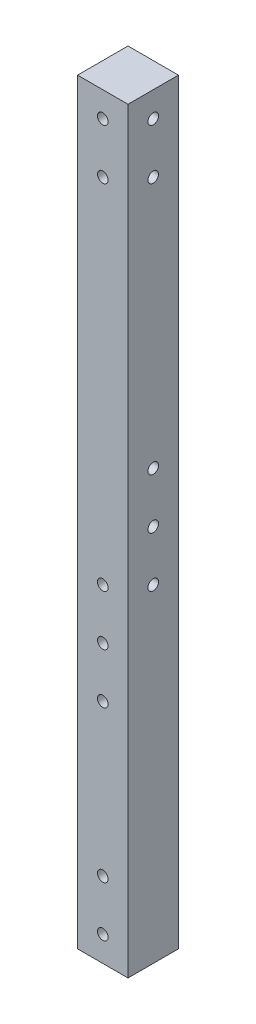
ISO-10303-21;
HEADER;
FILE_DESCRIPTION(('STEP AP214'),'2;1');
FILE_NAME('part.step','',(''),(''),'','','');
FILE_SCHEMA(('AUTOMOTIVE_DESIGN { 1 0 10303 214 1 1 1 1 }'));
ENDSEC;
DATA;
#1=APPLICATION_CONTEXT('core data for automotive mechanical design processes');
#2=APPLICATION_PROTOCOL_DEFINITION('international standard','automotive_design',2000,#1);
#3=PRODUCT_CONTEXT('',#1,'mechanical');
#4=PRODUCT('Part','Part','',(#3));
#5=PRODUCT_RELATED_PRODUCT_CATEGORY('part','',(#4));
#6=PRODUCT_DEFINITION_FORMATION('','',#4);
#7=PRODUCT_DEFINITION_CONTEXT('part definition',#1,'design');
#8=PRODUCT_DEFINITION('design','',#6,#7);
#9=PRODUCT_DEFINITION_SHAPE('','',#8);
#10=(LENGTH_UNIT() NAMED_UNIT(*) SI_UNIT(.MILLI.,.METRE.));
#11=(NAMED_UNIT(*) PLANE_ANGLE_UNIT() SI_UNIT($,.RADIAN.));
#12=(NAMED_UNIT(*) SI_UNIT($,.STERADIAN.) SOLID_ANGLE_UNIT());
#13=UNCERTAINTY_MEASURE_WITH_UNIT(LENGTH_MEASURE(1.E-05),#10,'distance_accuracy_value','');
#14=(GEOMETRIC_REPRESENTATION_CONTEXT(3) GLOBAL_UNCERTAINTY_ASSIGNED_CONTEXT((#13)) GLOBAL_UNIT_ASSIGNED_CONTEXT((#10,
#11,#12)) REPRESENTATION_CONTEXT('',''));
#15=CARTESIAN_POINT('',(0.,0.,0.));
#16=DIRECTION('',(0.,0.,1.));
#17=DIRECTION('',(1.,0.,0.));
#18=AXIS2_PLACEMENT_3D('',#15,#16,#17);
#19=CARTESIAN_POINT('',(10.,130.,0.));
#20=DIRECTION('',(-1.,0.,0.));
#21=DIRECTION('',(0.,0.,1.));
#22=AXIS2_PLACEMENT_3D('',#19,#20,#21);
#23=CYLINDRICAL_SURFACE('',#22,2.1);
#24=CARTESIAN_POINT('',(-10.,130.,0.));
#25=DIRECTION('',(-1.,0.,0.));
#26=DIRECTION('',(0.,0.,1.));
#27=AXIS2_PLACEMENT_3D('',#24,#25,#26);
#28=CIRCLE('',#27,2.1);
#29=CARTESIAN_POINT('',(-10.,130.,2.1));
#30=VERTEX_POINT('',#29);
#31=EDGE_CURVE('E235',#30,#30,#28,.T.);
#32=ORIENTED_EDGE('',*,*,#31,.T.);
#33=EDGE_LOOP('',(#32));
#34=FACE_BOUND('',#33,.T.);
#35=CARTESIAN_POINT('',(1.37126557278799E-13,130.,0.));
#36=DIRECTION('',(-0.707106781186547,0.,0.707106781186547));
#37=DIRECTION('',(-0.707106781186548,0.,-0.707106781186547));
#38=AXIS2_PLACEMENT_3D('',#35,#36,#37);
#39=ELLIPSE('',#38,2.9698484809835,2.1);
#40=CARTESIAN_POINT('',(1.37126557278799E-13,127.9,0.));
#41=VERTEX_POINT('',#40);
#42=CARTESIAN_POINT('',(1.37126557278799E-13,132.1,0.));
#43=VERTEX_POINT('',#42);
#44=EDGE_CURVE('E54',#41,#43,#39,.F.);
#45=ORIENTED_EDGE('',*,*,#44,.T.);
#46=CARTESIAN_POINT('',(1.37126557278799E-13,130.,0.));
#47=DIRECTION('',(-0.707106781186548,0.,-0.707106781186547));
#48=DIRECTION('',(-0.707106781186547,0.,0.707106781186547));
#49=AXIS2_PLACEMENT_3D('',#46,#47,#48);
#50=ELLIPSE('',#49,2.9698484809835,2.1);
#51=EDGE_CURVE('E11',#43,#41,#50,.F.);
#52=ORIENTED_EDGE('',*,*,#51,.T.);
#53=EDGE_LOOP('',(#45,#52));
#54=FACE_BOUND('',#53,.T.);
#55=ADVANCED_FACE('F40',(#34,#54),#23,.F.);
#56=CARTESIAN_POINT('',(0.,290.,-10.));
#57=DIRECTION('',(0.,0.,1.));
#58=DIRECTION('',(1.,0.,0.));
#59=AXIS2_PLACEMENT_3D('',#56,#57,#58);
#60=CYLINDRICAL_SURFACE('',#59,2.09999999999998);
#61=CARTESIAN_POINT('',(0.,290.,10.));
#62=DIRECTION('',(0.,0.,1.));
#63=DIRECTION('',(-1.,0.,0.));
#64=AXIS2_PLACEMENT_3D('',#61,#62,#63);
#65=CIRCLE('',#64,2.09999999999998);
#66=CARTESIAN_POINT('',(-2.09999999999998,290.,10.));
#67=VERTEX_POINT('',#66);
#68=EDGE_CURVE('E186',#67,#67,#65,.T.);
#69=ORIENTED_EDGE('',*,*,#68,.T.);
#70=EDGE_LOOP('',(#69));
#71=FACE_BOUND('',#70,.T.);
#72=CARTESIAN_POINT('',(0.,290.,0.));
#73=DIRECTION('',(-0.707106781186547,0.,0.707106781186547));
#74=DIRECTION('',(0.707106781186548,0.,0.707106781186547));
#75=AXIS2_PLACEMENT_3D('',#72,#73,#74);
#76=ELLIPSE('',#75,2.9698484809835,2.1);
#77=CARTESIAN_POINT('',(0.,292.1,0.));
#78=VERTEX_POINT('',#77);
#79=CARTESIAN_POINT('',(0.,287.9,0.));
#80=VERTEX_POINT('',#79);
#81=EDGE_CURVE('E61',#78,#80,#76,.F.);
#82=ORIENTED_EDGE('',*,*,#81,.T.);
#83=CARTESIAN_POINT('',(0.,290.,0.));
#84=DIRECTION('',(0.707106781186548,0.,0.707106781186547));
#85=DIRECTION('',(-0.707106781186547,0.,0.707106781186547));
#86=AXIS2_PLACEMENT_3D('',#83,#84,#85);
#87=ELLIPSE('',#86,2.9698484809835,2.1);
#88=EDGE_CURVE('E110',#80,#78,#87,.F.);
#89=ORIENTED_EDGE('',*,*,#88,.T.);
#90=EDGE_LOOP('',(#82,#89));
#91=FACE_BOUND('',#90,.T.);
#92=ADVANCED_FACE('F337',(#71,#91),#60,.F.);
#93=CARTESIAN_POINT('',(0.,270.,-10.));
#94=DIRECTION('',(0.,0.,1.));
#95=DIRECTION('',(1.,0.,0.));
#96=AXIS2_PLACEMENT_3D('',#93,#94,#95);
#97=CYLINDRICAL_SURFACE('',#96,2.10000000000002);
#98=CARTESIAN_POINT('',(0.,270.,10.));
#99=DIRECTION('',(0.,0.,1.));
#100=DIRECTION('',(-1.,0.,0.));
#101=AXIS2_PLACEMENT_3D('',#98,#99,#100);
#102=CIRCLE('',#101,2.10000000000002);
#103=CARTESIAN_POINT('',(-2.10000000000002,270.,10.));
#104=VERTEX_POINT('',#103);
#105=EDGE_CURVE('E195',#104,#104,#102,.T.);
#106=ORIENTED_EDGE('',*,*,#105,.T.);
#107=EDGE_LOOP('',(#106));
#108=FACE_BOUND('',#107,.T.);
#109=CARTESIAN_POINT('',(0.,270.,-2.08215525324329E-13));
#110=DIRECTION('',(-0.707106781186547,0.,0.707106781186547));
#111=DIRECTION('',(0.707106781186548,0.,0.707106781186547));
#112=AXIS2_PLACEMENT_3D('',#109,#110,#111);
#113=ELLIPSE('',#112,2.96984848098351,2.10000000000001);
#114=CARTESIAN_POINT('',(0.,272.1,-2.08215525324329E-13));
#115=VERTEX_POINT('',#114);
#116=CARTESIAN_POINT('',(0.,267.9,-2.08215525324329E-13));
#117=VERTEX_POINT('',#116);
#118=EDGE_CURVE('E140',#115,#117,#113,.F.);
#119=ORIENTED_EDGE('',*,*,#118,.T.);
#120=CARTESIAN_POINT('',(0.,270.,-2.08215525324329E-13));
#121=DIRECTION('',(0.707106781186548,0.,0.707106781186547));
#122=DIRECTION('',(-0.707106781186547,0.,0.707106781186547));
#123=AXIS2_PLACEMENT_3D('',#120,#121,#122);
#124=ELLIPSE('',#123,2.96984848098351,2.10000000000001);
#125=EDGE_CURVE('E128',#117,#115,#124,.F.);
#126=ORIENTED_EDGE('',*,*,#125,.T.);
#127=EDGE_LOOP('',(#119,#126));
#128=FACE_BOUND('',#127,.T.);
#129=ADVANCED_FACE('F344',(#108,#128),#97,.F.);
#130=CARTESIAN_POINT('',(10.,300.,-10.));
#131=DIRECTION('',(-1.,0.,0.));
#132=DIRECTION('',(0.,0.,1.));
#133=AXIS2_PLACEMENT_3D('',#130,#131,#132);
#134=PLANE('',#133);
#135=CARTESIAN_POINT('',(10.,290.,0.));
#136=DIRECTION('',(1.,0.,0.));
#137=DIRECTION('',(0.,0.,-1.));
#138=AXIS2_PLACEMENT_3D('',#135,#136,#137);
#139=CIRCLE('',#138,2.10000000000002);
#140=CARTESIAN_POINT('',(10.,290.,-2.1));
#141=VERTEX_POINT('',#140);
#142=EDGE_CURVE('E251',#141,#141,#139,.T.);
#143=ORIENTED_EDGE('',*,*,#142,.F.);
#144=EDGE_LOOP('',(#143));
#145=FACE_BOUND('',#144,.T.);
#146=CARTESIAN_POINT('',(10.,270.,-2.09131595269429E-13));
#147=DIRECTION('',(1.,0.,0.));
#148=DIRECTION('',(0.,0.,-1.));
#149=AXIS2_PLACEMENT_3D('',#146,#147,#148);
#150=CIRCLE('',#149,2.1);
#151=CARTESIAN_POINT('',(10.,270.,-2.10000000000021));
#152=VERTEX_POINT('',#151);
#153=EDGE_CURVE('E242',#152,#152,#150,.T.);
#154=ORIENTED_EDGE('',*,*,#153,.F.);
#155=EDGE_LOOP('',(#154));
#156=FACE_BOUND('',#155,.T.);
#157=CARTESIAN_POINT('',(10.,130.,0.));
#158=DIRECTION('',(-1.,0.,0.));
#159=DIRECTION('',(0.,0.,1.));
#160=AXIS2_PLACEMENT_3D('',#157,#158,#159);
#161=CIRCLE('',#160,2.1);
#162=CARTESIAN_POINT('',(10.,130.,2.1));
#163=VERTEX_POINT('',#162);
#164=EDGE_CURVE('E191',#163,#163,#161,.T.);
#165=ORIENTED_EDGE('',*,*,#164,.T.);
#166=EDGE_LOOP('',(#165));
#167=FACE_BOUND('',#166,.T.);
#168=CARTESIAN_POINT('',(10.,150.,0.));
#169=DIRECTION('',(-1.,0.,0.));
#170=DIRECTION('',(0.,0.,1.));
#171=AXIS2_PLACEMENT_3D('',#168,#169,#170);
#172=CIRCLE('',#171,2.1);
#173=CARTESIAN_POINT('',(10.,150.,2.09999999999993));
#174=VERTEX_POINT('',#173);
#175=EDGE_CURVE('E231',#174,#174,#172,.T.);
#176=ORIENTED_EDGE('',*,*,#175,.T.);
#177=EDGE_LOOP('',(#176));
#178=FACE_BOUND('',#177,.T.);
#179=CARTESIAN_POINT('',(10.,170.,-1.38077321693419E-13));
#180=DIRECTION('',(-1.,0.,0.));
#181=DIRECTION('',(0.,0.,1.));
#182=AXIS2_PLACEMENT_3D('',#179,#180,#181);
#183=CIRCLE('',#182,2.1);
#184=CARTESIAN_POINT('',(10.,170.,2.09999999999986));
#185=VERTEX_POINT('',#184);
#186=EDGE_CURVE('E222',#185,#185,#183,.T.);
#187=ORIENTED_EDGE('',*,*,#186,.T.);
#188=EDGE_LOOP('',(#187));
#189=FACE_BOUND('',#188,.T.);
#190=DIRECTION('',(0.,0.,-1.));
#191=VECTOR('',#190,1.);
#192=CARTESIAN_POINT('',(10.,0.,-10.));
#193=LINE('',#192,#191);
#194=CARTESIAN_POINT('',(10.,0.,10.));
#195=VERTEX_POINT('',#194);
#196=CARTESIAN_POINT('',(10.,0.,-10.));
#197=VERTEX_POINT('',#196);
#198=EDGE_CURVE('E170',#195,#197,#193,.T.);
#199=ORIENTED_EDGE('',*,*,#198,.T.);
#200=DIRECTION('',(0.,-1.,0.));
#201=VECTOR('',#200,1.);
#202=CARTESIAN_POINT('',(10.,300.,-10.));
#203=LINE('',#202,#201);
#204=CARTESIAN_POINT('',(10.,300.,-10.));
#205=VERTEX_POINT('',#204);
#206=EDGE_CURVE('E143',#205,#197,#203,.T.);
#207=ORIENTED_EDGE('',*,*,#206,.F.);
#208=DIRECTION('',(0.,0.,-1.));
#209=VECTOR('',#208,1.);
#210=CARTESIAN_POINT('',(10.,300.,-10.));
#211=LINE('',#210,#209);
#212=CARTESIAN_POINT('',(10.,300.,10.));
#213=VERTEX_POINT('',#212);
#214=EDGE_CURVE('E163',#213,#205,#211,.T.);
#215=ORIENTED_EDGE('',*,*,#214,.F.);
#216=DIRECTION('',(0.,-1.,0.));
#217=VECTOR('',#216,1.);
#218=CARTESIAN_POINT('',(10.,300.,10.));
#219=LINE('',#218,#217);
#220=EDGE_CURVE('E155',#213,#195,#219,.T.);
#221=ORIENTED_EDGE('',*,*,#220,.T.);
#222=EDGE_LOOP('',(#199,#207,#215,#221));
#223=FACE_BOUND('',#222,.T.);
#224=ADVANCED_FACE('F42',(#145,#156,#167,#178,#189,#223),#134,.F.);
#225=CARTESIAN_POINT('',(-10.,300.,-10.));
#226=DIRECTION('',(0.,0.,1.));
#227=DIRECTION('',(1.,0.,0.));
#228=AXIS2_PLACEMENT_3D('',#225,#226,#227);
#229=PLANE('',#228);
#230=CARTESIAN_POINT('',(0.,90.,-10.));
#231=DIRECTION('',(0.,0.,-1.));
#232=DIRECTION('',(-1.,0.,0.));
#233=AXIS2_PLACEMENT_3D('',#230,#231,#232);
#234=CIRCLE('',#233,2.1);
#235=CARTESIAN_POINT('',(-2.1,90.,-10.));
#236=VERTEX_POINT('',#235);
#237=EDGE_CURVE('E274',#236,#236,#234,.T.);
#238=ORIENTED_EDGE('',*,*,#237,.F.);
#239=EDGE_LOOP('',(#238));
#240=FACE_BOUND('',#239,.T.);
#241=CARTESIAN_POINT('',(0.,110.,-10.));
#242=DIRECTION('',(0.,0.,-1.));
#243=DIRECTION('',(-1.,0.,0.));
#244=AXIS2_PLACEMENT_3D('',#241,#242,#243);
#245=CIRCLE('',#244,2.1);
#246=CARTESIAN_POINT('',(-2.09999999999994,110.,-10.));
#247=VERTEX_POINT('',#246);
#248=EDGE_CURVE('E266',#247,#247,#245,.T.);
#249=ORIENTED_EDGE('',*,*,#248,.F.);
#250=EDGE_LOOP('',(#249));
#251=FACE_BOUND('',#250,.T.);
#252=CARTESIAN_POINT('',(1.37209959955431E-13,130.,-10.));
#253=DIRECTION('',(0.,0.,-1.));
#254=DIRECTION('',(-1.,0.,0.));
#255=AXIS2_PLACEMENT_3D('',#252,#253,#254);
#256=CIRCLE('',#255,2.1);
#257=CARTESIAN_POINT('',(-2.09999999999986,130.,-10.));
#258=VERTEX_POINT('',#257);
#259=EDGE_CURVE('E258',#258,#258,#256,.T.);
#260=ORIENTED_EDGE('',*,*,#259,.F.);
#261=EDGE_LOOP('',(#260));
#262=FACE_BOUND('',#261,.T.);
#263=CARTESIAN_POINT('',(0.,10.,-10.));
#264=DIRECTION('',(0.,0.,1.));
#265=DIRECTION('',(1.,0.,0.));
#266=AXIS2_PLACEMENT_3D('',#263,#264,#265);
#267=CIRCLE('',#266,2.09999999999998);
#268=CARTESIAN_POINT('',(2.09999999999998,10.,-10.));
#269=VERTEX_POINT('',#268);
#270=EDGE_CURVE('E174',#269,#269,#267,.T.);
#271=ORIENTED_EDGE('',*,*,#270,.T.);
#272=EDGE_LOOP('',(#271));
#273=FACE_BOUND('',#272,.T.);
#274=CARTESIAN_POINT('',(0.,30.,-10.));
#275=DIRECTION('',(0.,0.,1.));
#276=DIRECTION('',(1.,0.,0.));
#277=AXIS2_PLACEMENT_3D('',#274,#275,#276);
#278=CIRCLE('',#277,2.1);
#279=CARTESIAN_POINT('',(2.1,30.,-10.));
#280=VERTEX_POINT('',#279);
#281=EDGE_CURVE('E207',#280,#280,#278,.T.);
#282=ORIENTED_EDGE('',*,*,#281,.T.);
#283=EDGE_LOOP('',(#282));
#284=FACE_BOUND('',#283,.T.);
#285=CARTESIAN_POINT('',(0.,270.,-10.));
#286=DIRECTION('',(0.,0.,1.));
#287=DIRECTION('',(-1.,0.,0.));
#288=AXIS2_PLACEMENT_3D('',#285,#286,#287);
#289=CIRCLE('',#288,2.10000000000002);
#290=CARTESIAN_POINT('',(-2.10000000000002,270.,-10.));
#291=VERTEX_POINT('',#290);
#292=EDGE_CURVE('E199',#291,#291,#289,.T.);
#293=ORIENTED_EDGE('',*,*,#292,.T.);
#294=EDGE_LOOP('',(#293));
#295=FACE_BOUND('',#294,.T.);
#296=CARTESIAN_POINT('',(0.,290.,-10.));
#297=DIRECTION('',(0.,0.,1.));
#298=DIRECTION('',(-1.,0.,0.));
#299=AXIS2_PLACEMENT_3D('',#296,#297,#298);
#300=CIRCLE('',#299,2.09999999999998);
#301=CARTESIAN_POINT('',(-2.09999999999998,290.,-10.));
#302=VERTEX_POINT('',#301);
#303=EDGE_CURVE('E190',#302,#302,#300,.T.);
#304=ORIENTED_EDGE('',*,*,#303,.T.);
#305=EDGE_LOOP('',(#304));
#306=FACE_BOUND('',#305,.T.);
#307=DIRECTION('',(-1.,0.,0.));
#308=VECTOR('',#307,1.);
#309=CARTESIAN_POINT('',(-10.,0.,-10.));
#310=LINE('',#309,#308);
#311=CARTESIAN_POINT('',(-10.,0.,-10.));
#312=VERTEX_POINT('',#311);
#313=EDGE_CURVE('E167',#197,#312,#310,.T.);
#314=ORIENTED_EDGE('',*,*,#313,.T.);
#315=DIRECTION('',(0.,-1.,0.));
#316=VECTOR('',#315,1.);
#317=CARTESIAN_POINT('',(-10.,300.,-10.));
#318=LINE('',#317,#316);
#319=CARTESIAN_POINT('',(-10.,300.,-10.));
#320=VERTEX_POINT('',#319);
#321=EDGE_CURVE('E147',#320,#312,#318,.T.);
#322=ORIENTED_EDGE('',*,*,#321,.F.);
#323=DIRECTION('',(-1.,0.,0.));
#324=VECTOR('',#323,1.);
#325=CARTESIAN_POINT('',(-10.,300.,-10.));
#326=LINE('',#325,#324);
#327=EDGE_CURVE('E180',#205,#320,#326,.T.);
#328=ORIENTED_EDGE('',*,*,#327,.F.);
#329=ORIENTED_EDGE('',*,*,#206,.T.);
#330=EDGE_LOOP('',(#314,#322,#328,#329));
#331=FACE_BOUND('',#330,.T.);
#332=ADVANCED_FACE('F292',(#240,#251,#262,#273,#284,#295,#306,#331),#229,.F.);
#333=CARTESIAN_POINT('',(-10.,300.,-10.));
#334=DIRECTION('',(1.,0.,0.));
#335=DIRECTION('',(0.,0.,-1.));
#336=AXIS2_PLACEMENT_3D('',#333,#334,#335);
#337=PLANE('',#336);
#338=CARTESIAN_POINT('',(-10.,290.,0.));
#339=DIRECTION('',(1.,0.,0.));
#340=DIRECTION('',(0.,0.,-1.));
#341=AXIS2_PLACEMENT_3D('',#338,#339,#340);
#342=CIRCLE('',#341,2.10000000000002);
#343=CARTESIAN_POINT('',(-10.,290.,-2.1));
#344=VERTEX_POINT('',#343);
#345=EDGE_CURVE('E223',#344,#344,#342,.T.);
#346=ORIENTED_EDGE('',*,*,#345,.T.);
#347=EDGE_LOOP('',(#346));
#348=FACE_BOUND('',#347,.T.);
#349=CARTESIAN_POINT('',(-10.,270.,-2.07396871793452E-13));
#350=DIRECTION('',(1.,0.,0.));
#351=DIRECTION('',(0.,0.,-1.));
#352=AXIS2_PLACEMENT_3D('',#349,#350,#351);
#353=CIRCLE('',#352,2.1);
#354=CARTESIAN_POINT('',(-10.,270.,-2.1000000000002));
#355=VERTEX_POINT('',#354);
#356=EDGE_CURVE('E246',#355,#355,#353,.T.);
#357=ORIENTED_EDGE('',*,*,#356,.T.);
#358=EDGE_LOOP('',(#357));
#359=FACE_BOUND('',#358,.T.);
#360=ORIENTED_EDGE('',*,*,#31,.F.);
#361=EDGE_LOOP('',(#360));
#362=FACE_BOUND('',#361,.T.);
#363=CARTESIAN_POINT('',(-10.,150.,0.));
#364=DIRECTION('',(-1.,0.,0.));
#365=DIRECTION('',(0.,0.,1.));
#366=AXIS2_PLACEMENT_3D('',#363,#364,#365);
#367=CIRCLE('',#366,2.1);
#368=CARTESIAN_POINT('',(-10.,150.,2.09999999999993));
#369=VERTEX_POINT('',#368);
#370=EDGE_CURVE('E227',#369,#369,#367,.T.);
#371=ORIENTED_EDGE('',*,*,#370,.F.);
#372=EDGE_LOOP('',(#371));
#373=FACE_BOUND('',#372,.T.);
#374=CARTESIAN_POINT('',(-10.,170.,-1.36342598217442E-13));
#375=DIRECTION('',(-1.,0.,0.));
#376=DIRECTION('',(0.,0.,1.));
#377=AXIS2_PLACEMENT_3D('',#374,#375,#376);
#378=CIRCLE('',#377,2.1);
#379=CARTESIAN_POINT('',(-10.,170.,2.09999999999986));
#380=VERTEX_POINT('',#379);
#381=EDGE_CURVE('E218',#380,#380,#378,.T.);
#382=ORIENTED_EDGE('',*,*,#381,.F.);
#383=EDGE_LOOP('',(#382));
#384=FACE_BOUND('',#383,.T.);
#385=DIRECTION('',(0.,0.,1.));
#386=VECTOR('',#385,1.);
#387=CARTESIAN_POINT('',(-10.,0.,-10.));
#388=LINE('',#387,#386);
#389=CARTESIAN_POINT('',(-10.,0.,10.));
#390=VERTEX_POINT('',#389);
#391=EDGE_CURVE('E164',#312,#390,#388,.T.);
#392=ORIENTED_EDGE('',*,*,#391,.T.);
#393=DIRECTION('',(0.,-1.,0.));
#394=VECTOR('',#393,1.);
#395=CARTESIAN_POINT('',(-10.,300.,10.));
#396=LINE('',#395,#394);
#397=CARTESIAN_POINT('',(-10.,300.,10.));
#398=VERTEX_POINT('',#397);
#399=EDGE_CURVE('E151',#398,#390,#396,.T.);
#400=ORIENTED_EDGE('',*,*,#399,.F.);
#401=DIRECTION('',(0.,0.,1.));
#402=VECTOR('',#401,1.);
#403=CARTESIAN_POINT('',(-10.,300.,-10.));
#404=LINE('',#403,#402);
#405=EDGE_CURVE('E177',#320,#398,#404,.T.);
#406=ORIENTED_EDGE('',*,*,#405,.F.);
#407=ORIENTED_EDGE('',*,*,#321,.T.);
#408=EDGE_LOOP('',(#392,#400,#406,#407));
#409=FACE_BOUND('',#408,.T.);
#410=ADVANCED_FACE('F295',(#348,#359,#362,#373,#384,#409),#337,.F.);
#411=CARTESIAN_POINT('',(-10.,300.,10.));
#412=DIRECTION('',(0.,0.,-1.));
#413=DIRECTION('',(-1.,0.,0.));
#414=AXIS2_PLACEMENT_3D('',#411,#412,#413);
#415=PLANE('',#414);
#416=CARTESIAN_POINT('',(0.,90.,10.));
#417=DIRECTION('',(0.,0.,-1.));
#418=DIRECTION('',(-1.,0.,0.));
#419=AXIS2_PLACEMENT_3D('',#416,#417,#418);
#420=CIRCLE('',#419,2.1);
#421=CARTESIAN_POINT('',(-2.1,90.,10.));
#422=VERTEX_POINT('',#421);
#423=EDGE_CURVE('E247',#422,#422,#420,.T.);
#424=ORIENTED_EDGE('',*,*,#423,.T.);
#425=EDGE_LOOP('',(#424));
#426=FACE_BOUND('',#425,.T.);
#427=CARTESIAN_POINT('',(0.,110.,10.));
#428=DIRECTION('',(0.,0.,-1.));
#429=DIRECTION('',(-1.,0.,0.));
#430=AXIS2_PLACEMENT_3D('',#427,#428,#429);
#431=CIRCLE('',#430,2.1);
#432=CARTESIAN_POINT('',(-2.09999999999994,110.,10.));
#433=VERTEX_POINT('',#432);
#434=EDGE_CURVE('E270',#433,#433,#431,.T.);
#435=ORIENTED_EDGE('',*,*,#434,.T.);
#436=EDGE_LOOP('',(#435));
#437=FACE_BOUND('',#436,.T.);
#438=CARTESIAN_POINT('',(1.37209959955431E-13,130.,10.));
#439=DIRECTION('',(0.,0.,-1.));
#440=DIRECTION('',(-1.,0.,0.));
#441=AXIS2_PLACEMENT_3D('',#438,#439,#440);
#442=CIRCLE('',#441,2.1);
#443=CARTESIAN_POINT('',(-2.09999999999986,130.,10.));
#444=VERTEX_POINT('',#443);
#445=EDGE_CURVE('E262',#444,#444,#442,.T.);
#446=ORIENTED_EDGE('',*,*,#445,.T.);
#447=EDGE_LOOP('',(#446));
#448=FACE_BOUND('',#447,.T.);
#449=CARTESIAN_POINT('',(0.,10.,10.));
#450=DIRECTION('',(0.,0.,1.));
#451=DIRECTION('',(1.,0.,0.));
#452=AXIS2_PLACEMENT_3D('',#449,#450,#451);
#453=CIRCLE('',#452,2.09999999999998);
#454=CARTESIAN_POINT('',(2.09999999999998,10.,10.));
#455=VERTEX_POINT('',#454);
#456=EDGE_CURVE('E211',#455,#455,#453,.T.);
#457=ORIENTED_EDGE('',*,*,#456,.F.);
#458=EDGE_LOOP('',(#457));
#459=FACE_BOUND('',#458,.T.);
#460=CARTESIAN_POINT('',(0.,30.,10.));
#461=DIRECTION('',(0.,0.,1.));
#462=DIRECTION('',(1.,0.,0.));
#463=AXIS2_PLACEMENT_3D('',#460,#461,#462);
#464=CIRCLE('',#463,2.1);
#465=CARTESIAN_POINT('',(2.1,30.,10.));
#466=VERTEX_POINT('',#465);
#467=EDGE_CURVE('E203',#466,#466,#464,.T.);
#468=ORIENTED_EDGE('',*,*,#467,.F.);
#469=EDGE_LOOP('',(#468));
#470=FACE_BOUND('',#469,.T.);
#471=ORIENTED_EDGE('',*,*,#105,.F.);
#472=EDGE_LOOP('',(#471));
#473=FACE_BOUND('',#472,.T.);
#474=ORIENTED_EDGE('',*,*,#68,.F.);
#475=EDGE_LOOP('',(#474));
#476=FACE_BOUND('',#475,.T.);
#477=DIRECTION('',(1.,0.,0.));
#478=VECTOR('',#477,1.);
#479=CARTESIAN_POINT('',(-10.,0.,10.));
#480=LINE('',#479,#478);
#481=EDGE_CURVE('E160',#390,#195,#480,.T.);
#482=ORIENTED_EDGE('',*,*,#481,.T.);
#483=ORIENTED_EDGE('',*,*,#220,.F.);
#484=DIRECTION('',(1.,0.,0.));
#485=VECTOR('',#484,1.);
#486=CARTESIAN_POINT('',(-10.,300.,10.));
#487=LINE('',#486,#485);
#488=EDGE_CURVE('E159',#398,#213,#487,.T.);
#489=ORIENTED_EDGE('',*,*,#488,.F.);
#490=ORIENTED_EDGE('',*,*,#399,.T.);
#491=EDGE_LOOP('',(#482,#483,#489,#490));
#492=FACE_BOUND('',#491,.T.);
#493=ADVANCED_FACE('F282',(#426,#437,#448,#459,#470,#473,#476,#492),#415,.F.);
#494=CARTESIAN_POINT('',(0.,300.,0.));
#495=DIRECTION('',(0.,1.,0.));
#496=DIRECTION('',(0.,0.,1.));
#497=AXIS2_PLACEMENT_3D('',#494,#495,#496);
#498=PLANE('',#497);
#499=ORIENTED_EDGE('',*,*,#214,.T.);
#500=ORIENTED_EDGE('',*,*,#327,.T.);
#501=ORIENTED_EDGE('',*,*,#405,.T.);
#502=ORIENTED_EDGE('',*,*,#488,.T.);
#503=EDGE_LOOP('',(#499,#500,#501,#502));
#504=FACE_BOUND('',#503,.T.);
#505=ADVANCED_FACE('F324',(#504),#498,.T.);
#506=CARTESIAN_POINT('',(0.,0.,0.));
#507=DIRECTION('',(0.,1.,0.));
#508=DIRECTION('',(0.,0.,1.));
#509=AXIS2_PLACEMENT_3D('',#506,#507,#508);
#510=PLANE('',#509);
#511=ORIENTED_EDGE('',*,*,#198,.F.);
#512=ORIENTED_EDGE('',*,*,#481,.F.);
#513=ORIENTED_EDGE('',*,*,#391,.F.);
#514=ORIENTED_EDGE('',*,*,#313,.F.);
#515=EDGE_LOOP('',(#511,#512,#513,#514));
#516=FACE_BOUND('',#515,.T.);
#517=ADVANCED_FACE('F317',(#516),#510,.F.);
#518=CARTESIAN_POINT('',(0.,290.,0.));
#519=DIRECTION('',(-0.707106781186547,0.,0.707106781186547));
#520=DIRECTION('',(0.707106781186548,0.,0.707106781186547));
#521=AXIS2_PLACEMENT_3D('',#518,#519,#520);
#522=ELLIPSE('',#521,2.9698484809835,2.1);
#523=EDGE_CURVE('E122',#78,#80,#522,.T.);
#524=ORIENTED_EDGE('',*,*,#523,.T.);
#525=CARTESIAN_POINT('',(0.,290.,0.));
#526=DIRECTION('',(0.707106781186548,0.,0.707106781186547));
#527=DIRECTION('',(-0.707106781186547,0.,0.707106781186547));
#528=AXIS2_PLACEMENT_3D('',#525,#526,#527);
#529=ELLIPSE('',#528,2.9698484809835,2.1);
#530=EDGE_CURVE('E118',#80,#78,#529,.T.);
#531=ORIENTED_EDGE('',*,*,#530,.T.);
#532=EDGE_LOOP('',(#524,#531));
#533=FACE_BOUND('',#532,.T.);
#534=ORIENTED_EDGE('',*,*,#303,.F.);
#535=EDGE_LOOP('',(#534));
#536=FACE_BOUND('',#535,.T.);
#537=ADVANCED_FACE('F331',(#533,#536),#60,.F.);
#538=CARTESIAN_POINT('',(0.,270.,-2.08215525324329E-13));
#539=DIRECTION('',(-0.707106781186547,0.,0.707106781186547));
#540=DIRECTION('',(0.707106781186548,0.,0.707106781186547));
#541=AXIS2_PLACEMENT_3D('',#538,#539,#540);
#542=ELLIPSE('',#541,2.96984848098351,2.10000000000001);
#543=EDGE_CURVE('E136',#115,#117,#542,.T.);
#544=ORIENTED_EDGE('',*,*,#543,.T.);
#545=CARTESIAN_POINT('',(0.,270.,-2.08215525324329E-13));
#546=DIRECTION('',(0.707106781186548,0.,0.707106781186547));
#547=DIRECTION('',(-0.707106781186547,0.,0.707106781186547));
#548=AXIS2_PLACEMENT_3D('',#545,#546,#547);
#549=ELLIPSE('',#548,2.96984848098351,2.10000000000001);
#550=EDGE_CURVE('E132',#117,#115,#549,.T.);
#551=ORIENTED_EDGE('',*,*,#550,.T.);
#552=EDGE_LOOP('',(#544,#551));
#553=FACE_BOUND('',#552,.T.);
#554=ORIENTED_EDGE('',*,*,#292,.F.);
#555=EDGE_LOOP('',(#554));
#556=FACE_BOUND('',#555,.T.);
#557=ADVANCED_FACE('F375',(#553,#556),#97,.F.);
#558=CARTESIAN_POINT('',(0.,30.,-10.));
#559=DIRECTION('',(0.,0.,1.));
#560=DIRECTION('',(1.,0.,0.));
#561=AXIS2_PLACEMENT_3D('',#558,#559,#560);
#562=CYLINDRICAL_SURFACE('',#561,2.1);
#563=ORIENTED_EDGE('',*,*,#281,.F.);
#564=EDGE_LOOP('',(#563));
#565=FACE_BOUND('',#564,.T.);
#566=ORIENTED_EDGE('',*,*,#467,.T.);
#567=EDGE_LOOP('',(#566));
#568=FACE_BOUND('',#567,.T.);
#569=ADVANCED_FACE('F371',(#565,#568),#562,.F.);
#570=CARTESIAN_POINT('',(0.,10.,-10.));
#571=DIRECTION('',(0.,0.,1.));
#572=DIRECTION('',(1.,0.,0.));
#573=AXIS2_PLACEMENT_3D('',#570,#571,#572);
#574=CYLINDRICAL_SURFACE('',#573,2.09999999999998);
#575=ORIENTED_EDGE('',*,*,#270,.F.);
#576=EDGE_LOOP('',(#575));
#577=FACE_BOUND('',#576,.T.);
#578=ORIENTED_EDGE('',*,*,#456,.T.);
#579=EDGE_LOOP('',(#578));
#580=FACE_BOUND('',#579,.T.);
#581=ADVANCED_FACE('F363',(#577,#580),#574,.F.);
#582=CARTESIAN_POINT('',(10.,170.,-1.38077321693419E-13));
#583=DIRECTION('',(-1.,0.,0.));
#584=DIRECTION('',(0.,0.,1.));
#585=AXIS2_PLACEMENT_3D('',#582,#583,#584);
#586=CYLINDRICAL_SURFACE('',#585,2.1);
#587=ORIENTED_EDGE('',*,*,#186,.F.);
#588=EDGE_LOOP('',(#587));
#589=FACE_BOUND('',#588,.T.);
#590=ORIENTED_EDGE('',*,*,#381,.T.);
#591=EDGE_LOOP('',(#590));
#592=FACE_BOUND('',#591,.T.);
#593=ADVANCED_FACE('F358',(#589,#592),#586,.F.);
#594=CARTESIAN_POINT('',(10.,150.,0.));
#595=DIRECTION('',(-1.,0.,0.));
#596=DIRECTION('',(0.,0.,1.));
#597=AXIS2_PLACEMENT_3D('',#594,#595,#596);
#598=CYLINDRICAL_SURFACE('',#597,2.1);
#599=ORIENTED_EDGE('',*,*,#175,.F.);
#600=EDGE_LOOP('',(#599));
#601=FACE_BOUND('',#600,.T.);
#602=ORIENTED_EDGE('',*,*,#370,.T.);
#603=EDGE_LOOP('',(#602));
#604=FACE_BOUND('',#603,.T.);
#605=ADVANCED_FACE('F350',(#601,#604),#598,.F.);
#606=CARTESIAN_POINT('',(1.37126557278799E-13,130.,0.));
#607=DIRECTION('',(-0.707106781186547,0.,0.707106781186547));
#608=DIRECTION('',(-0.707106781186548,0.,-0.707106781186547));
#609=AXIS2_PLACEMENT_3D('',#606,#607,#608);
#610=ELLIPSE('',#609,2.9698484809835,2.1);
#611=EDGE_CURVE('E101',#41,#43,#610,.T.);
#612=ORIENTED_EDGE('',*,*,#611,.T.);
#613=CARTESIAN_POINT('',(1.37126557278799E-13,130.,0.));
#614=DIRECTION('',(-0.707106781186548,0.,-0.707106781186547));
#615=DIRECTION('',(-0.707106781186547,0.,0.707106781186547));
#616=AXIS2_PLACEMENT_3D('',#613,#614,#615);
#617=ELLIPSE('',#616,2.9698484809835,2.1);
#618=EDGE_CURVE('E49',#43,#41,#617,.T.);
#619=ORIENTED_EDGE('',*,*,#618,.T.);
#620=EDGE_LOOP('',(#612,#619));
#621=FACE_BOUND('',#620,.T.);
#622=ORIENTED_EDGE('',*,*,#164,.F.);
#623=EDGE_LOOP('',(#622));
#624=FACE_BOUND('',#623,.T.);
#625=ADVANCED_FACE('F112',(#621,#624),#23,.F.);
#626=CARTESIAN_POINT('',(-10.,270.,-2.07396871793452E-13));
#627=DIRECTION('',(1.,0.,0.));
#628=DIRECTION('',(0.,0.,-1.));
#629=AXIS2_PLACEMENT_3D('',#626,#627,#628);
#630=CYLINDRICAL_SURFACE('',#629,2.1);
#631=ORIENTED_EDGE('',*,*,#153,.T.);
#632=EDGE_LOOP('',(#631));
#633=FACE_BOUND('',#632,.T.);
#634=ORIENTED_EDGE('',*,*,#118,.F.);
#635=ORIENTED_EDGE('',*,*,#550,.F.);
#636=EDGE_LOOP('',(#634,#635));
#637=FACE_BOUND('',#636,.T.);
#638=ADVANCED_FACE('F349',(#633,#637),#630,.F.);
#639=ORIENTED_EDGE('',*,*,#356,.F.);
#640=EDGE_LOOP('',(#639));
#641=FACE_BOUND('',#640,.T.);
#642=ORIENTED_EDGE('',*,*,#543,.F.);
#643=ORIENTED_EDGE('',*,*,#125,.F.);
#644=EDGE_LOOP('',(#642,#643));
#645=FACE_BOUND('',#644,.T.);
#646=ADVANCED_FACE('F355',(#641,#645),#630,.F.);
#647=CARTESIAN_POINT('',(-10.,290.,0.));
#648=DIRECTION('',(1.,0.,0.));
#649=DIRECTION('',(0.,0.,-1.));
#650=AXIS2_PLACEMENT_3D('',#647,#648,#649);
#651=CYLINDRICAL_SURFACE('',#650,2.10000000000002);
#652=ORIENTED_EDGE('',*,*,#142,.T.);
#653=EDGE_LOOP('',(#652));
#654=FACE_BOUND('',#653,.T.);
#655=ORIENTED_EDGE('',*,*,#81,.F.);
#656=ORIENTED_EDGE('',*,*,#530,.F.);
#657=EDGE_LOOP('',(#655,#656));
#658=FACE_BOUND('',#657,.T.);
#659=ADVANCED_FACE('F389',(#654,#658),#651,.F.);
#660=ORIENTED_EDGE('',*,*,#345,.F.);
#661=EDGE_LOOP('',(#660));
#662=FACE_BOUND('',#661,.T.);
#663=ORIENTED_EDGE('',*,*,#523,.F.);
#664=ORIENTED_EDGE('',*,*,#88,.F.);
#665=EDGE_LOOP('',(#663,#664));
#666=FACE_BOUND('',#665,.T.);
#667=ADVANCED_FACE('F387',(#662,#666),#651,.F.);
#668=CARTESIAN_POINT('',(1.37209959955431E-13,130.,10.));
#669=DIRECTION('',(0.,0.,-1.));
#670=DIRECTION('',(-1.,0.,0.));
#671=AXIS2_PLACEMENT_3D('',#668,#669,#670);
#672=CYLINDRICAL_SURFACE('',#671,2.1);
#673=ORIENTED_EDGE('',*,*,#259,.T.);
#674=EDGE_LOOP('',(#673));
#675=FACE_BOUND('',#674,.T.);
#676=ORIENTED_EDGE('',*,*,#44,.F.);
#677=ORIENTED_EDGE('',*,*,#618,.F.);
#678=EDGE_LOOP('',(#676,#677));
#679=FACE_BOUND('',#678,.T.);
#680=ADVANCED_FACE('F108',(#675,#679),#672,.F.);
#681=ORIENTED_EDGE('',*,*,#445,.F.);
#682=EDGE_LOOP('',(#681));
#683=FACE_BOUND('',#682,.T.);
#684=ORIENTED_EDGE('',*,*,#611,.F.);
#685=ORIENTED_EDGE('',*,*,#51,.F.);
#686=EDGE_LOOP('',(#684,#685));
#687=FACE_BOUND('',#686,.T.);
#688=ADVANCED_FACE('F102',(#683,#687),#672,.F.);
#689=CARTESIAN_POINT('',(0.,110.,10.));
#690=DIRECTION('',(0.,0.,-1.));
#691=DIRECTION('',(-1.,0.,0.));
#692=AXIS2_PLACEMENT_3D('',#689,#690,#691);
#693=CYLINDRICAL_SURFACE('',#692,2.1);
#694=ORIENTED_EDGE('',*,*,#434,.F.);
#695=EDGE_LOOP('',(#694));
#696=FACE_BOUND('',#695,.T.);
#697=ORIENTED_EDGE('',*,*,#248,.T.);
#698=EDGE_LOOP('',(#697));
#699=FACE_BOUND('',#698,.T.);
#700=ADVANCED_FACE('F288',(#696,#699),#693,.F.);
#701=CARTESIAN_POINT('',(0.,90.,10.));
#702=DIRECTION('',(0.,0.,-1.));
#703=DIRECTION('',(-1.,0.,0.));
#704=AXIS2_PLACEMENT_3D('',#701,#702,#703);
#705=CYLINDRICAL_SURFACE('',#704,2.1);
#706=ORIENTED_EDGE('',*,*,#423,.F.);
#707=EDGE_LOOP('',(#706));
#708=FACE_BOUND('',#707,.T.);
#709=ORIENTED_EDGE('',*,*,#237,.T.);
#710=EDGE_LOOP('',(#709));
#711=FACE_BOUND('',#710,.T.);
#712=ADVANCED_FACE('F285',(#708,#711),#705,.F.);
#713=CLOSED_SHELL('',(#55,#92,#129,#224,#332,#410,#493,#505,#517,#537,#557,#569,#581,#593,#605,
#625,#638,#646,#659,#667,#680,#688,#700,#712));
#714=MANIFOLD_SOLID_BREP('B2',#713);
#715=ADVANCED_BREP_SHAPE_REPRESENTATION('',(#18,#714),#14);
#716=SHAPE_DEFINITION_REPRESENTATION(#9,#715);
ENDSEC;
END-ISO-10303-21;
